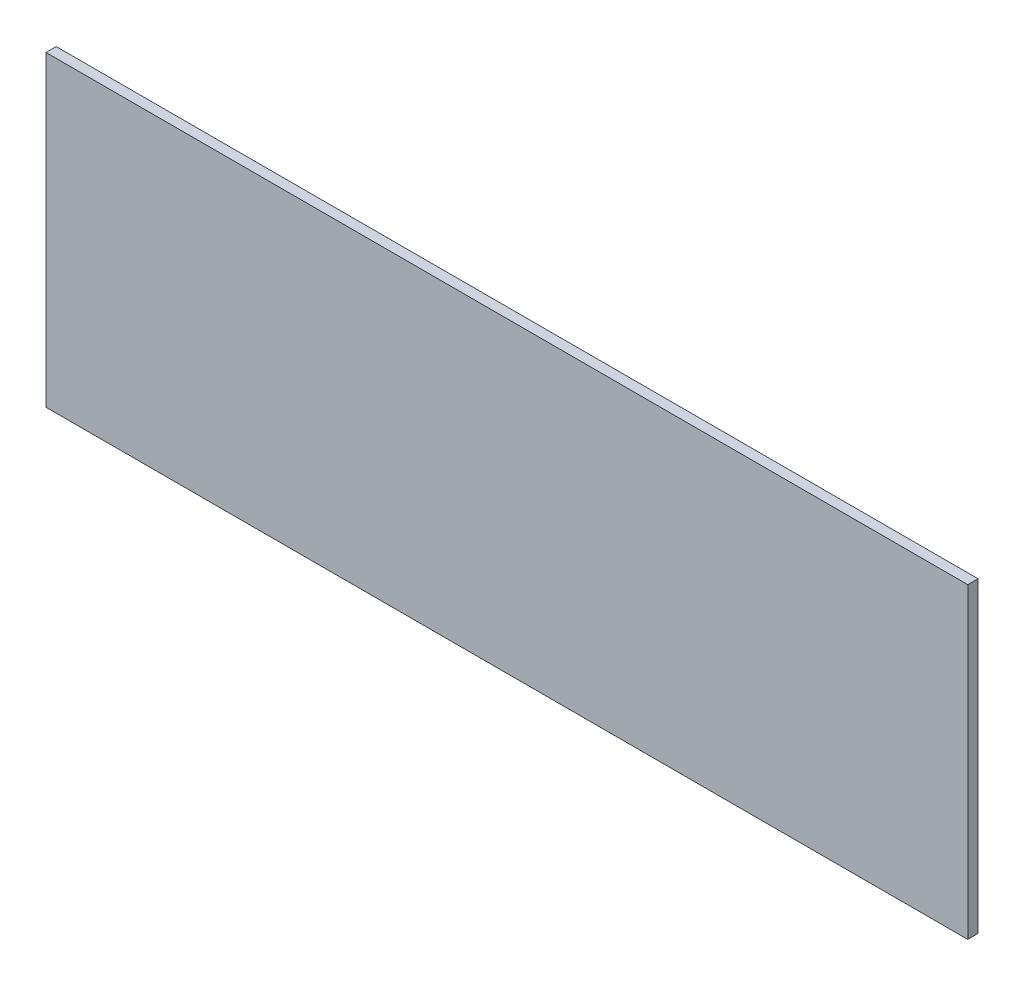
ISO-10303-21;
HEADER;
FILE_DESCRIPTION(('STEP AP214'),'2;1');
FILE_NAME('part.step','',(''),(''),'','','');
FILE_SCHEMA(('AUTOMOTIVE_DESIGN { 1 0 10303 214 1 1 1 1 }'));
ENDSEC;
DATA;
#1=APPLICATION_CONTEXT('core data for automotive mechanical design processes');
#2=APPLICATION_PROTOCOL_DEFINITION('international standard','automotive_design',2000,#1);
#3=PRODUCT_CONTEXT('',#1,'mechanical');
#4=PRODUCT('Part','Part','',(#3));
#5=PRODUCT_RELATED_PRODUCT_CATEGORY('part','',(#4));
#6=PRODUCT_DEFINITION_FORMATION('','',#4);
#7=PRODUCT_DEFINITION_CONTEXT('part definition',#1,'design');
#8=PRODUCT_DEFINITION('design','',#6,#7);
#9=PRODUCT_DEFINITION_SHAPE('','',#8);
#10=(LENGTH_UNIT() NAMED_UNIT(*) SI_UNIT(.MILLI.,.METRE.));
#11=(NAMED_UNIT(*) PLANE_ANGLE_UNIT() SI_UNIT($,.RADIAN.));
#12=(NAMED_UNIT(*) SI_UNIT($,.STERADIAN.) SOLID_ANGLE_UNIT());
#13=UNCERTAINTY_MEASURE_WITH_UNIT(LENGTH_MEASURE(1.E-05),#10,'distance_accuracy_value','');
#14=(GEOMETRIC_REPRESENTATION_CONTEXT(3) GLOBAL_UNCERTAINTY_ASSIGNED_CONTEXT((#13)) GLOBAL_UNIT_ASSIGNED_CONTEXT((#10,
#11,#12)) REPRESENTATION_CONTEXT('',''));
#15=CARTESIAN_POINT('',(0.,0.,0.));
#16=DIRECTION('',(0.,0.,1.));
#17=DIRECTION('',(1.,0.,0.));
#18=AXIS2_PLACEMENT_3D('',#15,#16,#17);
#19=CARTESIAN_POINT('',(-60.2542372881356,46.9067796610169,1.));
#20=DIRECTION('',(1.,0.,0.));
#21=DIRECTION('',(0.,1.,0.));
#22=AXIS2_PLACEMENT_3D('',#19,#20,#21);
#23=PLANE('',#22);
#24=DIRECTION('',(0.,-1.,0.));
#25=VECTOR('',#24,1.);
#26=CARTESIAN_POINT('',(-60.2542372881356,46.9067796610169,0.));
#27=LINE('',#26,#25);
#28=CARTESIAN_POINT('',(-60.2542372881356,46.9067796610169,0.));
#29=VERTEX_POINT('',#28);
#30=CARTESIAN_POINT('',(-60.2542372881356,16.9067796610169,0.));
#31=VERTEX_POINT('',#30);
#32=EDGE_CURVE('E96',#29,#31,#27,.T.);
#33=ORIENTED_EDGE('',*,*,#32,.T.);
#34=DIRECTION('',(0.,0.,-1.));
#35=VECTOR('',#34,1.);
#36=CARTESIAN_POINT('',(-60.2542372881356,16.9067796610169,1.));
#37=LINE('',#36,#35);
#38=CARTESIAN_POINT('',(-60.2542372881356,16.9067796610169,1.));
#39=VERTEX_POINT('',#38);
#40=EDGE_CURVE('E11',#39,#31,#37,.T.);
#41=ORIENTED_EDGE('',*,*,#40,.F.);
#42=DIRECTION('',(0.,-1.,0.));
#43=VECTOR('',#42,1.);
#44=CARTESIAN_POINT('',(-60.2542372881356,46.9067796610169,1.));
#45=LINE('',#44,#43);
#46=CARTESIAN_POINT('',(-60.2542372881356,46.9067796610169,1.));
#47=VERTEX_POINT('',#46);
#48=EDGE_CURVE('E84',#47,#39,#45,.T.);
#49=ORIENTED_EDGE('',*,*,#48,.F.);
#50=DIRECTION('',(0.,0.,-1.));
#51=VECTOR('',#50,1.);
#52=CARTESIAN_POINT('',(-60.2542372881356,46.9067796610169,1.));
#53=LINE('',#52,#51);
#54=EDGE_CURVE('E92',#47,#29,#53,.T.);
#55=ORIENTED_EDGE('',*,*,#54,.T.);
#56=EDGE_LOOP('',(#33,#41,#49,#55));
#57=FACE_BOUND('',#56,.T.);
#58=ADVANCED_FACE('F33',(#57),#23,.F.);
#59=CARTESIAN_POINT('',(-60.2542372881356,16.9067796610169,1.));
#60=DIRECTION('',(0.,1.,0.));
#61=DIRECTION('',(0.,0.,1.));
#62=AXIS2_PLACEMENT_3D('',#59,#60,#61);
#63=PLANE('',#62);
#64=DIRECTION('',(1.,0.,0.));
#65=VECTOR('',#64,1.);
#66=CARTESIAN_POINT('',(-60.2542372881356,16.9067796610169,0.));
#67=LINE('',#66,#65);
#68=CARTESIAN_POINT('',(29.7457627118644,16.9067796610169,0.));
#69=VERTEX_POINT('',#68);
#70=EDGE_CURVE('E88',#31,#69,#67,.T.);
#71=ORIENTED_EDGE('',*,*,#70,.T.);
#72=DIRECTION('',(0.,0.,-1.));
#73=VECTOR('',#72,1.);
#74=CARTESIAN_POINT('',(29.7457627118644,16.9067796610169,1.));
#75=LINE('',#74,#73);
#76=CARTESIAN_POINT('',(29.7457627118644,16.9067796610169,1.));
#77=VERTEX_POINT('',#76);
#78=EDGE_CURVE('E41',#77,#69,#75,.T.);
#79=ORIENTED_EDGE('',*,*,#78,.F.);
#80=DIRECTION('',(1.,0.,0.));
#81=VECTOR('',#80,1.);
#82=CARTESIAN_POINT('',(-60.2542372881356,16.9067796610169,1.));
#83=LINE('',#82,#81);
#84=EDGE_CURVE('E79',#39,#77,#83,.T.);
#85=ORIENTED_EDGE('',*,*,#84,.F.);
#86=ORIENTED_EDGE('',*,*,#40,.T.);
#87=EDGE_LOOP('',(#71,#79,#85,#86));
#88=FACE_BOUND('',#87,.T.);
#89=ADVANCED_FACE('F87',(#88),#63,.F.);
#90=CARTESIAN_POINT('',(29.7457627118644,46.9067796610169,1.));
#91=DIRECTION('',(-1.,0.,0.));
#92=DIRECTION('',(0.,-1.,0.));
#93=AXIS2_PLACEMENT_3D('',#90,#91,#92);
#94=PLANE('',#93);
#95=DIRECTION('',(0.,1.,0.));
#96=VECTOR('',#95,1.);
#97=CARTESIAN_POINT('',(29.7457627118644,46.9067796610169,0.));
#98=LINE('',#97,#96);
#99=CARTESIAN_POINT('',(29.7457627118644,46.9067796610169,0.));
#100=VERTEX_POINT('',#99);
#101=EDGE_CURVE('E66',#69,#100,#98,.T.);
#102=ORIENTED_EDGE('',*,*,#101,.T.);
#103=DIRECTION('',(0.,0.,-1.));
#104=VECTOR('',#103,1.);
#105=CARTESIAN_POINT('',(29.7457627118644,46.9067796610169,1.));
#106=LINE('',#105,#104);
#107=CARTESIAN_POINT('',(29.7457627118644,46.9067796610169,1.));
#108=VERTEX_POINT('',#107);
#109=EDGE_CURVE('E89',#108,#100,#106,.T.);
#110=ORIENTED_EDGE('',*,*,#109,.F.);
#111=DIRECTION('',(0.,1.,0.));
#112=VECTOR('',#111,1.);
#113=CARTESIAN_POINT('',(29.7457627118644,46.9067796610169,1.));
#114=LINE('',#113,#112);
#115=EDGE_CURVE('E82',#77,#108,#114,.T.);
#116=ORIENTED_EDGE('',*,*,#115,.F.);
#117=ORIENTED_EDGE('',*,*,#78,.T.);
#118=EDGE_LOOP('',(#102,#110,#116,#117));
#119=FACE_BOUND('',#118,.T.);
#120=ADVANCED_FACE('F90',(#119),#94,.F.);
#121=CARTESIAN_POINT('',(-60.2542372881356,46.9067796610169,1.));
#122=DIRECTION('',(0.,-1.,0.));
#123=DIRECTION('',(0.,0.,-1.));
#124=AXIS2_PLACEMENT_3D('',#121,#122,#123);
#125=PLANE('',#124);
#126=DIRECTION('',(-1.,0.,0.));
#127=VECTOR('',#126,1.);
#128=CARTESIAN_POINT('',(-60.2542372881356,46.9067796610169,0.));
#129=LINE('',#128,#127);
#130=EDGE_CURVE('E72',#100,#29,#129,.T.);
#131=ORIENTED_EDGE('',*,*,#130,.T.);
#132=ORIENTED_EDGE('',*,*,#54,.F.);
#133=DIRECTION('',(-1.,0.,0.));
#134=VECTOR('',#133,1.);
#135=CARTESIAN_POINT('',(-60.2542372881356,46.9067796610169,1.));
#136=LINE('',#135,#134);
#137=EDGE_CURVE('E49',#108,#47,#136,.T.);
#138=ORIENTED_EDGE('',*,*,#137,.F.);
#139=ORIENTED_EDGE('',*,*,#109,.T.);
#140=EDGE_LOOP('',(#131,#132,#138,#139));
#141=FACE_BOUND('',#140,.T.);
#142=ADVANCED_FACE('F103',(#141),#125,.F.);
#143=CARTESIAN_POINT('',(0.,0.,1.));
#144=DIRECTION('',(0.,0.,1.));
#145=DIRECTION('',(1.,0.,0.));
#146=AXIS2_PLACEMENT_3D('',#143,#144,#145);
#147=PLANE('',#146);
#148=ORIENTED_EDGE('',*,*,#48,.T.);
#149=ORIENTED_EDGE('',*,*,#84,.T.);
#150=ORIENTED_EDGE('',*,*,#115,.T.);
#151=ORIENTED_EDGE('',*,*,#137,.T.);
#152=EDGE_LOOP('',(#148,#149,#150,#151));
#153=FACE_BOUND('',#152,.T.);
#154=ADVANCED_FACE('F80',(#153),#147,.T.);
#155=CARTESIAN_POINT('',(0.,0.,0.));
#156=DIRECTION('',(0.,0.,1.));
#157=DIRECTION('',(1.,0.,0.));
#158=AXIS2_PLACEMENT_3D('',#155,#156,#157);
#159=PLANE('',#158);
#160=ORIENTED_EDGE('',*,*,#32,.F.);
#161=ORIENTED_EDGE('',*,*,#130,.F.);
#162=ORIENTED_EDGE('',*,*,#101,.F.);
#163=ORIENTED_EDGE('',*,*,#70,.F.);
#164=EDGE_LOOP('',(#160,#161,#162,#163));
#165=FACE_BOUND('',#164,.T.);
#166=ADVANCED_FACE('F106',(#165),#159,.F.);
#167=CLOSED_SHELL('',(#58,#89,#120,#142,#154,#166));
#168=MANIFOLD_SOLID_BREP('B2',#167);
#169=ADVANCED_BREP_SHAPE_REPRESENTATION('',(#18,#168),#14);
#170=SHAPE_DEFINITION_REPRESENTATION(#9,#169);
ENDSEC;
END-ISO-10303-21;
